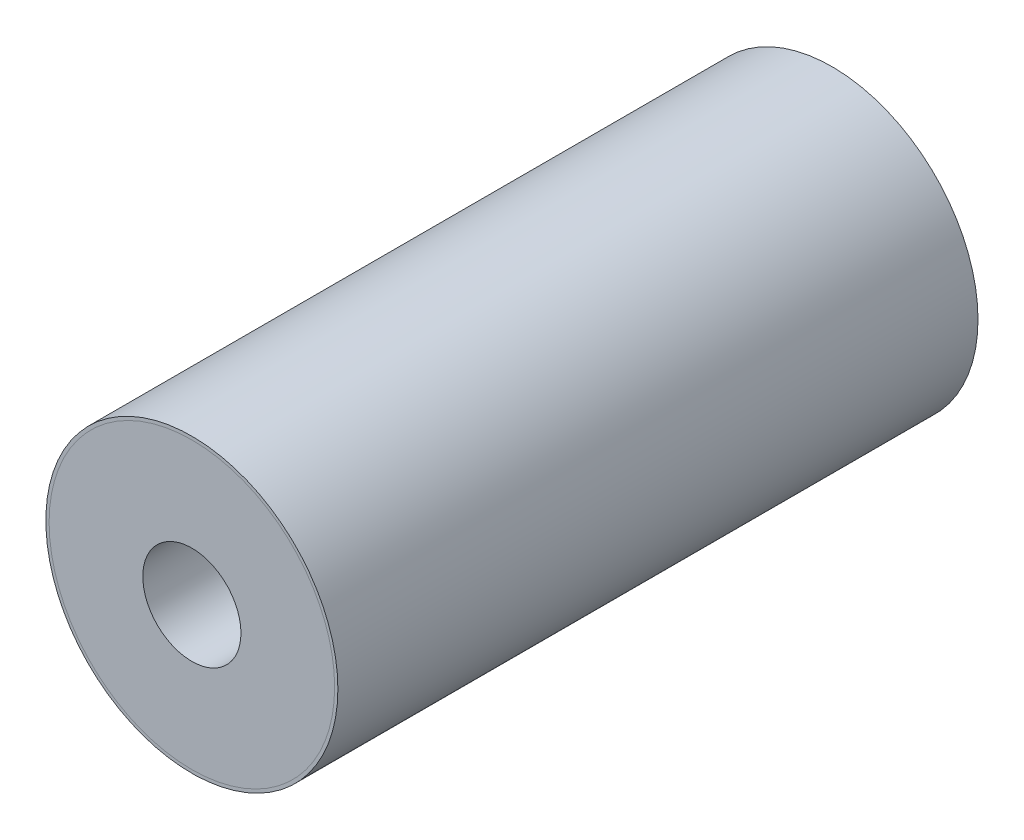
ISO-10303-21;
HEADER;
FILE_DESCRIPTION(('STEP AP214'),'2;1');
FILE_NAME('part.step','',(''),(''),'','','');
FILE_SCHEMA(('AUTOMOTIVE_DESIGN { 1 0 10303 214 1 1 1 1 }'));
ENDSEC;
DATA;
#1=APPLICATION_CONTEXT('core data for automotive mechanical design processes');
#2=APPLICATION_PROTOCOL_DEFINITION('international standard','automotive_design',2000,#1);
#3=PRODUCT_CONTEXT('',#1,'mechanical');
#4=PRODUCT('Part','Part','',(#3));
#5=PRODUCT_RELATED_PRODUCT_CATEGORY('part','',(#4));
#6=PRODUCT_DEFINITION_FORMATION('','',#4);
#7=PRODUCT_DEFINITION_CONTEXT('part definition',#1,'design');
#8=PRODUCT_DEFINITION('design','',#6,#7);
#9=PRODUCT_DEFINITION_SHAPE('','',#8);
#10=(LENGTH_UNIT() NAMED_UNIT(*) SI_UNIT(.MILLI.,.METRE.));
#11=(NAMED_UNIT(*) PLANE_ANGLE_UNIT() SI_UNIT($,.RADIAN.));
#12=(NAMED_UNIT(*) SI_UNIT($,.STERADIAN.) SOLID_ANGLE_UNIT());
#13=UNCERTAINTY_MEASURE_WITH_UNIT(LENGTH_MEASURE(1.E-05),#10,'distance_accuracy_value','');
#14=(GEOMETRIC_REPRESENTATION_CONTEXT(3) GLOBAL_UNCERTAINTY_ASSIGNED_CONTEXT((#13)) GLOBAL_UNIT_ASSIGNED_CONTEXT((#10,
#11,#12)) REPRESENTATION_CONTEXT('',''));
#15=CARTESIAN_POINT('',(0.,0.,0.));
#16=DIRECTION('',(0.,0.,1.));
#17=DIRECTION('',(1.,0.,0.));
#18=AXIS2_PLACEMENT_3D('',#15,#16,#17);
#19=CARTESIAN_POINT('',(0.,0.,118.305785192968));
#20=DIRECTION('',(0.,0.,-1.));
#21=DIRECTION('',(-1.,0.,0.));
#22=AXIS2_PLACEMENT_3D('',#19,#20,#21);
#23=CYLINDRICAL_SURFACE('',#22,16.1798);
#24=CARTESIAN_POINT('',(0.,0.,0.));
#25=DIRECTION('',(0.,0.,1.));
#26=DIRECTION('',(1.,0.,0.));
#27=AXIS2_PLACEMENT_3D('',#24,#25,#26);
#28=CIRCLE('',#27,16.1798);
#29=CARTESIAN_POINT('',(16.1798,0.,0.));
#30=VERTEX_POINT('',#29);
#31=EDGE_CURVE('E63',#30,#30,#28,.T.);
#32=ORIENTED_EDGE('',*,*,#31,.T.);
#33=EDGE_LOOP('',(#32));
#34=FACE_BOUND('',#33,.T.);
#35=CARTESIAN_POINT('',(0.,0.,72.5424));
#36=DIRECTION('',(0.,0.,1.));
#37=DIRECTION('',(1.,0.,0.));
#38=AXIS2_PLACEMENT_3D('',#35,#36,#37);
#39=CIRCLE('',#38,16.1798);
#40=CARTESIAN_POINT('',(16.1798,0.,72.5424));
#41=VERTEX_POINT('',#40);
#42=EDGE_CURVE('E11',#41,#41,#39,.T.);
#43=ORIENTED_EDGE('',*,*,#42,.F.);
#44=EDGE_LOOP('',(#43));
#45=FACE_BOUND('',#44,.T.);
#46=ADVANCED_FACE('F55',(#34,#45),#23,.T.);
#47=CARTESIAN_POINT('',(0.,0.,0.));
#48=DIRECTION('',(0.,0.,1.));
#49=DIRECTION('',(1.,0.,0.));
#50=AXIS2_PLACEMENT_3D('',#47,#48,#49);
#51=PLANE('',#50);
#52=CARTESIAN_POINT('',(0.,0.,0.));
#53=DIRECTION('',(0.,0.,1.));
#54=DIRECTION('',(1.,0.,0.));
#55=AXIS2_PLACEMENT_3D('',#52,#53,#54);
#56=CIRCLE('',#55,5.56259999999999);
#57=CARTESIAN_POINT('',(5.56259999999999,0.,0.));
#58=VERTEX_POINT('',#57);
#59=EDGE_CURVE('E68',#58,#58,#56,.T.);
#60=ORIENTED_EDGE('',*,*,#59,.T.);
#61=EDGE_LOOP('',(#60));
#62=FACE_BOUND('',#61,.T.);
#63=ORIENTED_EDGE('',*,*,#31,.F.);
#64=EDGE_LOOP('',(#63));
#65=FACE_BOUND('',#64,.T.);
#66=ADVANCED_FACE('F83',(#62,#65),#51,.F.);
#67=CARTESIAN_POINT('',(0.,0.,72.5424));
#68=DIRECTION('',(0.,0.,1.));
#69=DIRECTION('',(1.,0.,0.));
#70=AXIS2_PLACEMENT_3D('',#67,#68,#69);
#71=PLANE('',#70);
#72=CARTESIAN_POINT('',(0.,0.,72.5424));
#73=DIRECTION('',(0.,0.,1.));
#74=DIRECTION('',(1.,0.,0.));
#75=AXIS2_PLACEMENT_3D('',#72,#73,#74);
#76=CIRCLE('',#75,5.5626);
#77=CARTESIAN_POINT('',(5.5626,0.,72.5424));
#78=VERTEX_POINT('',#77);
#79=EDGE_CURVE('E73',#78,#78,#76,.T.);
#80=ORIENTED_EDGE('',*,*,#79,.F.);
#81=EDGE_LOOP('',(#80));
#82=FACE_BOUND('',#81,.T.);
#83=ORIENTED_EDGE('',*,*,#42,.T.);
#84=EDGE_LOOP('',(#83));
#85=FACE_BOUND('',#84,.T.);
#86=ADVANCED_FACE('F57',(#82,#85),#71,.T.);
#87=CARTESIAN_POINT('',(0.,0.,72.5424));
#88=DIRECTION('',(0.,0.,1.));
#89=DIRECTION('',(1.,0.,0.));
#90=AXIS2_PLACEMENT_3D('',#87,#88,#89);
#91=CYLINDRICAL_SURFACE('',#90,5.56259999999999);
#92=ORIENTED_EDGE('',*,*,#59,.F.);
#93=EDGE_LOOP('',(#92));
#94=FACE_BOUND('',#93,.T.);
#95=ORIENTED_EDGE('',*,*,#79,.T.);
#96=EDGE_LOOP('',(#95));
#97=FACE_BOUND('',#96,.T.);
#98=ADVANCED_FACE('F80',(#94,#97),#91,.F.);
#99=CLOSED_SHELL('',(#46,#66,#86,#98));
#100=MANIFOLD_SOLID_BREP('B2',#99);
#101=CARTESIAN_POINT('',(0.,0.,72.5424));
#102=DIRECTION('',(0.,0.,1.));
#103=DIRECTION('',(1.,0.,0.));
#104=AXIS2_PLACEMENT_3D('',#101,#102,#103);
#105=PLANE('',#104);
#106=CARTESIAN_POINT('',(0.,0.,72.5424));
#107=DIRECTION('',(0.,0.,1.));
#108=DIRECTION('',(1.,0.,0.));
#109=AXIS2_PLACEMENT_3D('',#106,#107,#108);
#110=CIRCLE('',#109,16.5481);
#111=CARTESIAN_POINT('',(16.5481,0.,72.5424));
#112=VERTEX_POINT('',#111);
#113=EDGE_CURVE('E54',#112,#112,#110,.T.);
#114=ORIENTED_EDGE('',*,*,#113,.T.);
#115=EDGE_LOOP('',(#114));
#116=FACE_BOUND('',#115,.T.);
#117=CARTESIAN_POINT('',(0.,0.,72.5424));
#118=DIRECTION('',(0.,0.,1.));
#119=DIRECTION('',(1.,0.,0.));
#120=AXIS2_PLACEMENT_3D('',#117,#118,#119);
#121=CIRCLE('',#120,16.1798);
#122=CARTESIAN_POINT('',(16.1798,0.,72.5424));
#123=VERTEX_POINT('',#122);
#124=EDGE_CURVE('E148',#123,#123,#121,.T.);
#125=ORIENTED_EDGE('',*,*,#124,.F.);
#126=EDGE_LOOP('',(#125));
#127=FACE_BOUND('',#126,.T.);
#128=ADVANCED_FACE('F137',(#116,#127),#105,.T.);
#129=CARTESIAN_POINT('',(0.,0.,0.));
#130=DIRECTION('',(0.,0.,1.));
#131=DIRECTION('',(1.,0.,0.));
#132=AXIS2_PLACEMENT_3D('',#129,#130,#131);
#133=PLANE('',#132);
#134=CARTESIAN_POINT('',(0.,0.,0.));
#135=DIRECTION('',(0.,0.,1.));
#136=DIRECTION('',(1.,0.,0.));
#137=AXIS2_PLACEMENT_3D('',#134,#135,#136);
#138=CIRCLE('',#137,16.5481);
#139=CARTESIAN_POINT('',(16.5481,0.,0.));
#140=VERTEX_POINT('',#139);
#141=EDGE_CURVE('E141',#140,#140,#138,.T.);
#142=ORIENTED_EDGE('',*,*,#141,.F.);
#143=EDGE_LOOP('',(#142));
#144=FACE_BOUND('',#143,.T.);
#145=CARTESIAN_POINT('',(0.,0.,0.));
#146=DIRECTION('',(0.,0.,1.));
#147=DIRECTION('',(1.,0.,0.));
#148=AXIS2_PLACEMENT_3D('',#145,#146,#147);
#149=CIRCLE('',#148,16.1798);
#150=CARTESIAN_POINT('',(16.1798,0.,0.));
#151=VERTEX_POINT('',#150);
#152=EDGE_CURVE('E150',#151,#151,#149,.T.);
#153=ORIENTED_EDGE('',*,*,#152,.T.);
#154=EDGE_LOOP('',(#153));
#155=FACE_BOUND('',#154,.T.);
#156=ADVANCED_FACE('F160',(#144,#155),#133,.F.);
#157=CARTESIAN_POINT('',(0.,0.,72.5424));
#158=DIRECTION('',(0.,0.,-1.));
#159=DIRECTION('',(-1.,0.,0.));
#160=AXIS2_PLACEMENT_3D('',#157,#158,#159);
#161=CYLINDRICAL_SURFACE('',#160,16.5481);
#162=ORIENTED_EDGE('',*,*,#113,.F.);
#163=EDGE_LOOP('',(#162));
#164=FACE_BOUND('',#163,.T.);
#165=ORIENTED_EDGE('',*,*,#141,.T.);
#166=EDGE_LOOP('',(#165));
#167=FACE_BOUND('',#166,.T.);
#168=ADVANCED_FACE('F139',(#164,#167),#161,.T.);
#169=CARTESIAN_POINT('',(0.,0.,72.5424));
#170=DIRECTION('',(0.,0.,-1.));
#171=DIRECTION('',(-1.,0.,0.));
#172=AXIS2_PLACEMENT_3D('',#169,#170,#171);
#173=CYLINDRICAL_SURFACE('',#172,16.1798);
#174=ORIENTED_EDGE('',*,*,#124,.T.);
#175=EDGE_LOOP('',(#174));
#176=FACE_BOUND('',#175,.T.);
#177=ORIENTED_EDGE('',*,*,#152,.F.);
#178=EDGE_LOOP('',(#177));
#179=FACE_BOUND('',#178,.T.);
#180=ADVANCED_FACE('F156',(#176,#179),#173,.F.);
#181=CLOSED_SHELL('',(#128,#156,#168,#180));
#182=MANIFOLD_SOLID_BREP('B6',#181);
#183=ADVANCED_BREP_SHAPE_REPRESENTATION('',(#18,#100,#182),#14);
#184=SHAPE_DEFINITION_REPRESENTATION(#9,#183);
ENDSEC;
END-ISO-10303-21;
